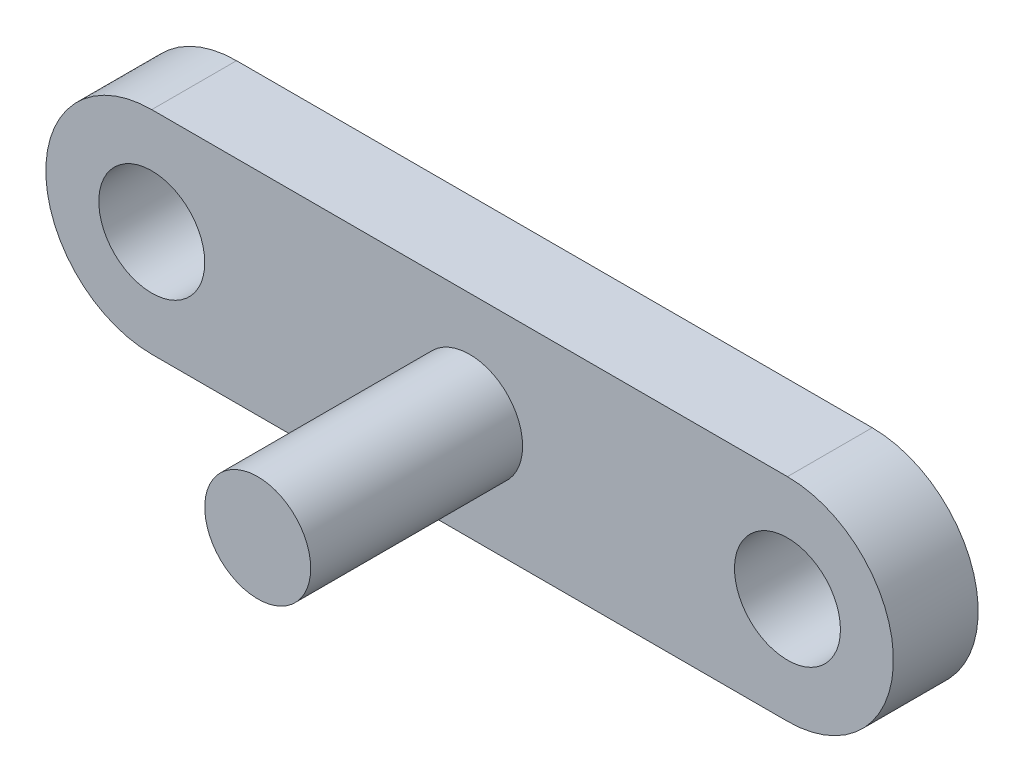
ISO-10303-21;
HEADER;
FILE_DESCRIPTION(('STEP AP214'),'2;1');
FILE_NAME('part.step','',(''),(''),'','','');
FILE_SCHEMA(('AUTOMOTIVE_DESIGN { 1 0 10303 214 1 1 1 1 }'));
ENDSEC;
DATA;
#1=APPLICATION_CONTEXT('core data for automotive mechanical design processes');
#2=APPLICATION_PROTOCOL_DEFINITION('international standard','automotive_design',2000,#1);
#3=PRODUCT_CONTEXT('',#1,'mechanical');
#4=PRODUCT('Part','Part','',(#3));
#5=PRODUCT_RELATED_PRODUCT_CATEGORY('part','',(#4));
#6=PRODUCT_DEFINITION_FORMATION('','',#4);
#7=PRODUCT_DEFINITION_CONTEXT('part definition',#1,'design');
#8=PRODUCT_DEFINITION('design','',#6,#7);
#9=PRODUCT_DEFINITION_SHAPE('','',#8);
#10=(LENGTH_UNIT() NAMED_UNIT(*) SI_UNIT(.MILLI.,.METRE.));
#11=(NAMED_UNIT(*) PLANE_ANGLE_UNIT() SI_UNIT($,.RADIAN.));
#12=(NAMED_UNIT(*) SI_UNIT($,.STERADIAN.) SOLID_ANGLE_UNIT());
#13=UNCERTAINTY_MEASURE_WITH_UNIT(LENGTH_MEASURE(1.E-05),#10,'distance_accuracy_value','');
#14=(GEOMETRIC_REPRESENTATION_CONTEXT(3) GLOBAL_UNCERTAINTY_ASSIGNED_CONTEXT((#13)) GLOBAL_UNIT_ASSIGNED_CONTEXT((#10,
#11,#12)) REPRESENTATION_CONTEXT('',''));
#15=CARTESIAN_POINT('',(0.,0.,0.));
#16=DIRECTION('',(0.,0.,1.));
#17=DIRECTION('',(1.,0.,0.));
#18=AXIS2_PLACEMENT_3D('',#15,#16,#17);
#19=CARTESIAN_POINT('',(-87.7822538529846,10.6635336323928,4.));
#20=DIRECTION('',(0.,0.,1.));
#21=DIRECTION('',(1.,0.,0.));
#22=AXIS2_PLACEMENT_3D('',#19,#20,#21);
#23=PLANE('',#22);
#24=CARTESIAN_POINT('',(-87.7822538529846,10.6635336323928,4.));
#25=DIRECTION('',(0.,0.,1.));
#26=DIRECTION('',(1.,0.,0.));
#27=AXIS2_PLACEMENT_3D('',#24,#25,#26);
#28=CIRCLE('',#27,2.5);
#29=CARTESIAN_POINT('',(-85.2822538529846,10.6635336323928,4.));
#30=VERTEX_POINT('',#29);
#31=EDGE_CURVE('E115',#30,#30,#28,.T.);
#32=ORIENTED_EDGE('',*,*,#31,.F.);
#33=EDGE_LOOP('',(#32));
#34=FACE_BOUND('',#33,.T.);
#35=CARTESIAN_POINT('',(-87.7822538529846,10.6635336323928,4.));
#36=DIRECTION('',(0.,0.,1.));
#37=DIRECTION('',(1.,0.,0.));
#38=AXIS2_PLACEMENT_3D('',#35,#36,#37);
#39=CIRCLE('',#38,5.);
#40=CARTESIAN_POINT('',(-87.7822538529846,15.6635336323928,4.));
#41=VERTEX_POINT('',#40);
#42=CARTESIAN_POINT('',(-87.7822538529846,5.66353363239276,4.));
#43=VERTEX_POINT('',#42);
#44=EDGE_CURVE('E85',#41,#43,#39,.T.);
#45=ORIENTED_EDGE('',*,*,#44,.T.);
#46=DIRECTION('',(1.,0.,0.));
#47=VECTOR('',#46,1.);
#48=CARTESIAN_POINT('',(-57.7822538529846,5.66353363239276,4.));
#49=LINE('',#48,#47);
#50=CARTESIAN_POINT('',(-57.7822538529846,5.66353363239276,4.));
#51=VERTEX_POINT('',#50);
#52=EDGE_CURVE('E80',#43,#51,#49,.T.);
#53=ORIENTED_EDGE('',*,*,#52,.T.);
#54=CARTESIAN_POINT('',(-57.7822538529846,10.6635336323928,4.));
#55=DIRECTION('',(0.,0.,1.));
#56=DIRECTION('',(1.,0.,0.));
#57=AXIS2_PLACEMENT_3D('',#54,#55,#56);
#58=CIRCLE('',#57,5.);
#59=CARTESIAN_POINT('',(-57.7822538529846,15.6635336323928,4.));
#60=VERTEX_POINT('',#59);
#61=EDGE_CURVE('E83',#51,#60,#58,.T.);
#62=ORIENTED_EDGE('',*,*,#61,.T.);
#63=DIRECTION('',(-1.,0.,0.));
#64=VECTOR('',#63,1.);
#65=CARTESIAN_POINT('',(-57.7822538529846,15.6635336323928,4.));
#66=LINE('',#65,#64);
#67=EDGE_CURVE('E50',#60,#41,#66,.T.);
#68=ORIENTED_EDGE('',*,*,#67,.T.);
#69=EDGE_LOOP('',(#45,#53,#62,#68));
#70=FACE_BOUND('',#69,.T.);
#71=CARTESIAN_POINT('',(-57.7822538529846,10.6635336323928,4.));
#72=DIRECTION('',(0.,0.,1.));
#73=DIRECTION('',(1.,0.,0.));
#74=AXIS2_PLACEMENT_3D('',#71,#72,#73);
#75=CIRCLE('',#74,2.5);
#76=CARTESIAN_POINT('',(-55.2822538529846,10.6635336323928,4.));
#77=VERTEX_POINT('',#76);
#78=EDGE_CURVE('E100',#77,#77,#75,.T.);
#79=ORIENTED_EDGE('',*,*,#78,.F.);
#80=EDGE_LOOP('',(#79));
#81=FACE_BOUND('',#80,.T.);
#82=CARTESIAN_POINT('',(-72.7822538529846,10.6635336323928,4.));
#83=DIRECTION('',(0.,0.,1.));
#84=DIRECTION('',(1.,0.,0.));
#85=AXIS2_PLACEMENT_3D('',#82,#83,#84);
#86=CIRCLE('',#85,2.50000000000001);
#87=CARTESIAN_POINT('',(-70.2822538529846,10.6635336323928,4.));
#88=VERTEX_POINT('',#87);
#89=EDGE_CURVE('E124',#88,#88,#86,.T.);
#90=ORIENTED_EDGE('',*,*,#89,.F.);
#91=EDGE_LOOP('',(#90));
#92=FACE_BOUND('',#91,.T.);
#93=ADVANCED_FACE('F33',(#34,#70,#81,#92),#23,.T.);
#94=CARTESIAN_POINT('',(-87.7822538529846,10.6635336323928,0.));
#95=DIRECTION('',(0.,0.,1.));
#96=DIRECTION('',(1.,0.,0.));
#97=AXIS2_PLACEMENT_3D('',#94,#95,#96);
#98=PLANE('',#97);
#99=CARTESIAN_POINT('',(-57.7822538529846,10.6635336323928,0.));
#100=DIRECTION('',(0.,0.,1.));
#101=DIRECTION('',(1.,0.,0.));
#102=AXIS2_PLACEMENT_3D('',#99,#100,#101);
#103=CIRCLE('',#102,2.5);
#104=CARTESIAN_POINT('',(-55.2822538529846,10.6635336323928,0.));
#105=VERTEX_POINT('',#104);
#106=EDGE_CURVE('E112',#105,#105,#103,.T.);
#107=ORIENTED_EDGE('',*,*,#106,.T.);
#108=EDGE_LOOP('',(#107));
#109=FACE_BOUND('',#108,.T.);
#110=CARTESIAN_POINT('',(-87.7822538529846,10.6635336323928,0.));
#111=DIRECTION('',(0.,0.,1.));
#112=DIRECTION('',(1.,0.,0.));
#113=AXIS2_PLACEMENT_3D('',#110,#111,#112);
#114=CIRCLE('',#113,5.);
#115=CARTESIAN_POINT('',(-87.7822538529846,15.6635336323928,0.));
#116=VERTEX_POINT('',#115);
#117=CARTESIAN_POINT('',(-87.7822538529846,5.66353363239276,0.));
#118=VERTEX_POINT('',#117);
#119=EDGE_CURVE('E97',#116,#118,#114,.T.);
#120=ORIENTED_EDGE('',*,*,#119,.F.);
#121=DIRECTION('',(-1.,0.,0.));
#122=VECTOR('',#121,1.);
#123=CARTESIAN_POINT('',(-57.7822538529846,15.6635336323928,0.));
#124=LINE('',#123,#122);
#125=CARTESIAN_POINT('',(-57.7822538529846,15.6635336323928,0.));
#126=VERTEX_POINT('',#125);
#127=EDGE_CURVE('E73',#126,#116,#124,.T.);
#128=ORIENTED_EDGE('',*,*,#127,.F.);
#129=CARTESIAN_POINT('',(-57.7822538529846,10.6635336323928,0.));
#130=DIRECTION('',(0.,0.,1.));
#131=DIRECTION('',(1.,0.,0.));
#132=AXIS2_PLACEMENT_3D('',#129,#130,#131);
#133=CIRCLE('',#132,5.);
#134=CARTESIAN_POINT('',(-57.7822538529846,5.66353363239276,0.));
#135=VERTEX_POINT('',#134);
#136=EDGE_CURVE('E67',#135,#126,#133,.T.);
#137=ORIENTED_EDGE('',*,*,#136,.F.);
#138=DIRECTION('',(1.,0.,0.));
#139=VECTOR('',#138,1.);
#140=CARTESIAN_POINT('',(-57.7822538529846,5.66353363239276,0.));
#141=LINE('',#140,#139);
#142=EDGE_CURVE('E89',#118,#135,#141,.T.);
#143=ORIENTED_EDGE('',*,*,#142,.F.);
#144=EDGE_LOOP('',(#120,#128,#137,#143));
#145=FACE_BOUND('',#144,.T.);
#146=CARTESIAN_POINT('',(-87.7822538529846,10.6635336323928,0.));
#147=DIRECTION('',(0.,0.,1.));
#148=DIRECTION('',(1.,0.,0.));
#149=AXIS2_PLACEMENT_3D('',#146,#147,#148);
#150=CIRCLE('',#149,2.5);
#151=CARTESIAN_POINT('',(-85.2822538529846,10.6635336323928,0.));
#152=VERTEX_POINT('',#151);
#153=EDGE_CURVE('E118',#152,#152,#150,.T.);
#154=ORIENTED_EDGE('',*,*,#153,.T.);
#155=EDGE_LOOP('',(#154));
#156=FACE_BOUND('',#155,.T.);
#157=ADVANCED_FACE('F108',(#109,#145,#156),#98,.F.);
#158=CARTESIAN_POINT('',(-87.7822538529846,10.6635336323928,4.));
#159=DIRECTION('',(0.,0.,-1.));
#160=DIRECTION('',(-1.,0.,0.));
#161=AXIS2_PLACEMENT_3D('',#158,#159,#160);
#162=CYLINDRICAL_SURFACE('',#161,5.);
#163=ORIENTED_EDGE('',*,*,#119,.T.);
#164=DIRECTION('',(0.,0.,-1.));
#165=VECTOR('',#164,1.);
#166=CARTESIAN_POINT('',(-87.7822538529846,5.66353363239276,4.));
#167=LINE('',#166,#165);
#168=EDGE_CURVE('E11',#43,#118,#167,.T.);
#169=ORIENTED_EDGE('',*,*,#168,.F.);
#170=ORIENTED_EDGE('',*,*,#44,.F.);
#171=DIRECTION('',(0.,0.,-1.));
#172=VECTOR('',#171,1.);
#173=CARTESIAN_POINT('',(-87.7822538529846,15.6635336323928,4.));
#174=LINE('',#173,#172);
#175=EDGE_CURVE('E93',#41,#116,#174,.T.);
#176=ORIENTED_EDGE('',*,*,#175,.T.);
#177=EDGE_LOOP('',(#163,#169,#170,#176));
#178=FACE_BOUND('',#177,.T.);
#179=ADVANCED_FACE('F35',(#178),#162,.T.);
#180=CARTESIAN_POINT('',(-57.7822538529846,5.66353363239276,4.));
#181=DIRECTION('',(0.,1.,0.));
#182=DIRECTION('',(-1.,0.,0.));
#183=AXIS2_PLACEMENT_3D('',#180,#181,#182);
#184=PLANE('',#183);
#185=ORIENTED_EDGE('',*,*,#142,.T.);
#186=DIRECTION('',(0.,0.,-1.));
#187=VECTOR('',#186,1.);
#188=CARTESIAN_POINT('',(-57.7822538529846,5.66353363239276,4.));
#189=LINE('',#188,#187);
#190=EDGE_CURVE('E42',#51,#135,#189,.T.);
#191=ORIENTED_EDGE('',*,*,#190,.F.);
#192=ORIENTED_EDGE('',*,*,#52,.F.);
#193=ORIENTED_EDGE('',*,*,#168,.T.);
#194=EDGE_LOOP('',(#185,#191,#192,#193));
#195=FACE_BOUND('',#194,.T.);
#196=ADVANCED_FACE('F88',(#195),#184,.F.);
#197=CARTESIAN_POINT('',(-57.7822538529846,10.6635336323928,4.));
#198=DIRECTION('',(0.,0.,-1.));
#199=DIRECTION('',(-1.,0.,0.));
#200=AXIS2_PLACEMENT_3D('',#197,#198,#199);
#201=CYLINDRICAL_SURFACE('',#200,5.);
#202=ORIENTED_EDGE('',*,*,#136,.T.);
#203=DIRECTION('',(0.,0.,-1.));
#204=VECTOR('',#203,1.);
#205=CARTESIAN_POINT('',(-57.7822538529846,15.6635336323928,4.));
#206=LINE('',#205,#204);
#207=EDGE_CURVE('E90',#60,#126,#206,.T.);
#208=ORIENTED_EDGE('',*,*,#207,.F.);
#209=ORIENTED_EDGE('',*,*,#61,.F.);
#210=ORIENTED_EDGE('',*,*,#190,.T.);
#211=EDGE_LOOP('',(#202,#208,#209,#210));
#212=FACE_BOUND('',#211,.T.);
#213=ADVANCED_FACE('F91',(#212),#201,.T.);
#214=CARTESIAN_POINT('',(-57.7822538529846,15.6635336323928,4.));
#215=DIRECTION('',(0.,-1.,0.));
#216=DIRECTION('',(1.,0.,0.));
#217=AXIS2_PLACEMENT_3D('',#214,#215,#216);
#218=PLANE('',#217);
#219=ORIENTED_EDGE('',*,*,#127,.T.);
#220=ORIENTED_EDGE('',*,*,#175,.F.);
#221=ORIENTED_EDGE('',*,*,#67,.F.);
#222=ORIENTED_EDGE('',*,*,#207,.T.);
#223=EDGE_LOOP('',(#219,#220,#221,#222));
#224=FACE_BOUND('',#223,.T.);
#225=ADVANCED_FACE('F105',(#224),#218,.F.);
#226=CARTESIAN_POINT('',(-57.7822538529846,10.6635336323928,4.));
#227=DIRECTION('',(0.,0.,-1.));
#228=DIRECTION('',(-1.,0.,0.));
#229=AXIS2_PLACEMENT_3D('',#226,#227,#228);
#230=CYLINDRICAL_SURFACE('',#229,2.5);
#231=ORIENTED_EDGE('',*,*,#78,.T.);
#232=EDGE_LOOP('',(#231));
#233=FACE_BOUND('',#232,.T.);
#234=ORIENTED_EDGE('',*,*,#106,.F.);
#235=EDGE_LOOP('',(#234));
#236=FACE_BOUND('',#235,.T.);
#237=ADVANCED_FACE('F149',(#233,#236),#230,.F.);
#238=CARTESIAN_POINT('',(-87.7822538529846,10.6635336323928,4.));
#239=DIRECTION('',(0.,0.,-1.));
#240=DIRECTION('',(-1.,0.,0.));
#241=AXIS2_PLACEMENT_3D('',#238,#239,#240);
#242=CYLINDRICAL_SURFACE('',#241,2.5);
#243=ORIENTED_EDGE('',*,*,#31,.T.);
#244=EDGE_LOOP('',(#243));
#245=FACE_BOUND('',#244,.T.);
#246=ORIENTED_EDGE('',*,*,#153,.F.);
#247=EDGE_LOOP('',(#246));
#248=FACE_BOUND('',#247,.T.);
#249=ADVANCED_FACE('F135',(#245,#248),#242,.F.);
#250=CARTESIAN_POINT('',(-72.7822538529846,10.6635336323928,14.));
#251=DIRECTION('',(0.,0.,-1.));
#252=DIRECTION('',(-1.,0.,0.));
#253=AXIS2_PLACEMENT_3D('',#250,#251,#252);
#254=CYLINDRICAL_SURFACE('',#253,2.50000000000001);
#255=CARTESIAN_POINT('',(-72.7822538529846,10.6635336323928,14.));
#256=DIRECTION('',(0.,0.,1.));
#257=DIRECTION('',(1.,0.,0.));
#258=AXIS2_PLACEMENT_3D('',#255,#256,#257);
#259=CIRCLE('',#258,2.50000000000001);
#260=CARTESIAN_POINT('',(-70.2822538529846,10.6635336323928,14.));
#261=VERTEX_POINT('',#260);
#262=EDGE_CURVE('E121',#261,#261,#259,.T.);
#263=ORIENTED_EDGE('',*,*,#262,.F.);
#264=EDGE_LOOP('',(#263));
#265=FACE_BOUND('',#264,.T.);
#266=ORIENTED_EDGE('',*,*,#89,.T.);
#267=EDGE_LOOP('',(#266));
#268=FACE_BOUND('',#267,.T.);
#269=ADVANCED_FACE('F132',(#265,#268),#254,.T.);
#270=CARTESIAN_POINT('',(-72.7822538529846,10.6635336323928,14.));
#271=DIRECTION('',(0.,0.,1.));
#272=DIRECTION('',(1.,0.,0.));
#273=AXIS2_PLACEMENT_3D('',#270,#271,#272);
#274=PLANE('',#273);
#275=ORIENTED_EDGE('',*,*,#262,.T.);
#276=EDGE_LOOP('',(#275));
#277=FACE_BOUND('',#276,.T.);
#278=ADVANCED_FACE('F130',(#277),#274,.T.);
#279=CLOSED_SHELL('',(#93,#157,#179,#196,#213,#225,#237,#249,#269,#278));
#280=MANIFOLD_SOLID_BREP('B2',#279);
#281=ADVANCED_BREP_SHAPE_REPRESENTATION('',(#18,#280),#14);
#282=SHAPE_DEFINITION_REPRESENTATION(#9,#281);
ENDSEC;
END-ISO-10303-21;
